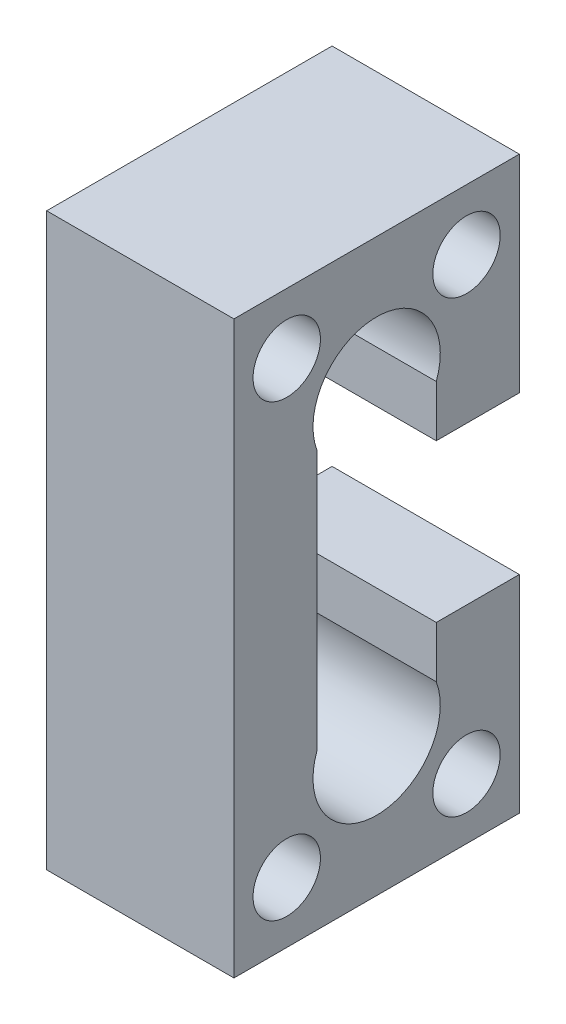
ISO-10303-21;
HEADER;
FILE_DESCRIPTION(('STEP AP214'),'2;1');
FILE_NAME('part.step','',(''),(''),'','','');
FILE_SCHEMA(('AUTOMOTIVE_DESIGN { 1 0 10303 214 1 1 1 1 }'));
ENDSEC;
DATA;
#1=APPLICATION_CONTEXT('core data for automotive mechanical design processes');
#2=APPLICATION_PROTOCOL_DEFINITION('international standard','automotive_design',2000,#1);
#3=PRODUCT_CONTEXT('',#1,'mechanical');
#4=PRODUCT('Part','Part','',(#3));
#5=PRODUCT_RELATED_PRODUCT_CATEGORY('part','',(#4));
#6=PRODUCT_DEFINITION_FORMATION('','',#4);
#7=PRODUCT_DEFINITION_CONTEXT('part definition',#1,'design');
#8=PRODUCT_DEFINITION('design','',#6,#7);
#9=PRODUCT_DEFINITION_SHAPE('','',#8);
#10=(LENGTH_UNIT() NAMED_UNIT(*) SI_UNIT(.MILLI.,.METRE.));
#11=(NAMED_UNIT(*) PLANE_ANGLE_UNIT() SI_UNIT($,.RADIAN.));
#12=(NAMED_UNIT(*) SI_UNIT($,.STERADIAN.) SOLID_ANGLE_UNIT());
#13=UNCERTAINTY_MEASURE_WITH_UNIT(LENGTH_MEASURE(1.E-05),#10,'distance_accuracy_value','');
#14=(GEOMETRIC_REPRESENTATION_CONTEXT(3) GLOBAL_UNCERTAINTY_ASSIGNED_CONTEXT((#13)) GLOBAL_UNIT_ASSIGNED_CONTEXT((#10,
#11,#12)) REPRESENTATION_CONTEXT('',''));
#15=CARTESIAN_POINT('',(0.,0.,0.));
#16=DIRECTION('',(0.,0.,1.));
#17=DIRECTION('',(1.,0.,0.));
#18=AXIS2_PLACEMENT_3D('',#15,#16,#17);
#19=CARTESIAN_POINT('',(-12.5,38.1,-19.05));
#20=DIRECTION('',(0.,0.,-1.));
#21=DIRECTION('',(-1.,0.,0.));
#22=AXIS2_PLACEMENT_3D('',#19,#20,#21);
#23=PLANE('',#22);
#24=DIRECTION('',(1.,0.,0.));
#25=VECTOR('',#24,1.);
#26=CARTESIAN_POINT('',(-12.5,10.5,-19.05));
#27=LINE('',#26,#25);
#28=CARTESIAN_POINT('',(-12.5,10.5,-19.05));
#29=VERTEX_POINT('',#28);
#30=CARTESIAN_POINT('',(12.5,10.5,-19.05));
#31=VERTEX_POINT('',#30);
#32=EDGE_CURVE('E164',#29,#31,#27,.T.);
#33=ORIENTED_EDGE('',*,*,#32,.F.);
#34=DIRECTION('',(0.,-1.,0.));
#35=VECTOR('',#34,1.);
#36=CARTESIAN_POINT('',(-12.5,-38.1,-19.05));
#37=LINE('',#36,#35);
#38=CARTESIAN_POINT('',(-12.5,38.1,-19.05));
#39=VERTEX_POINT('',#38);
#40=EDGE_CURVE('E180',#39,#29,#37,.T.);
#41=ORIENTED_EDGE('',*,*,#40,.F.);
#42=DIRECTION('',(-1.,0.,0.));
#43=VECTOR('',#42,1.);
#44=CARTESIAN_POINT('',(-12.5,38.1,-19.05));
#45=LINE('',#44,#43);
#46=CARTESIAN_POINT('',(12.5,38.1,-19.05));
#47=VERTEX_POINT('',#46);
#48=EDGE_CURVE('E191',#47,#39,#45,.T.);
#49=ORIENTED_EDGE('',*,*,#48,.F.);
#50=DIRECTION('',(0.,1.,0.));
#51=VECTOR('',#50,1.);
#52=CARTESIAN_POINT('',(12.5,-38.1,-19.05));
#53=LINE('',#52,#51);
#54=EDGE_CURVE('E187',#31,#47,#53,.T.);
#55=ORIENTED_EDGE('',*,*,#54,.F.);
#56=EDGE_LOOP('',(#33,#41,#49,#55));
#57=FACE_BOUND('',#56,.T.);
#58=ADVANCED_FACE('F34',(#57),#23,.T.);
#59=CARTESIAN_POINT('',(-12.5,-38.1,-19.05));
#60=DIRECTION('',(-1.,0.,0.));
#61=DIRECTION('',(0.,0.,1.));
#62=AXIS2_PLACEMENT_3D('',#59,#60,#61);
#63=PLANE('',#62);
#64=CARTESIAN_POINT('',(-12.5,30.,12.));
#65=DIRECTION('',(1.,0.,0.));
#66=DIRECTION('',(0.,0.,-1.));
#67=AXIS2_PLACEMENT_3D('',#64,#65,#66);
#68=CIRCLE('',#67,4.5);
#69=CARTESIAN_POINT('',(-12.5,30.,7.50000000000001));
#70=VERTEX_POINT('',#69);
#71=EDGE_CURVE('E403',#70,#70,#68,.T.);
#72=ORIENTED_EDGE('',*,*,#71,.T.);
#73=EDGE_LOOP('',(#72));
#74=FACE_BOUND('',#73,.T.);
#75=CARTESIAN_POINT('',(-12.5,30.,-12.));
#76=DIRECTION('',(1.,0.,0.));
#77=DIRECTION('',(0.,0.,-1.));
#78=AXIS2_PLACEMENT_3D('',#75,#76,#77);
#79=CIRCLE('',#78,4.5);
#80=CARTESIAN_POINT('',(-12.5,30.,-16.5));
#81=VERTEX_POINT('',#80);
#82=EDGE_CURVE('E413',#81,#81,#79,.T.);
#83=ORIENTED_EDGE('',*,*,#82,.T.);
#84=EDGE_LOOP('',(#83));
#85=FACE_BOUND('',#84,.T.);
#86=CARTESIAN_POINT('',(-12.5,-30.,-12.));
#87=DIRECTION('',(1.,0.,0.));
#88=DIRECTION('',(0.,0.,-1.));
#89=AXIS2_PLACEMENT_3D('',#86,#87,#88);
#90=CIRCLE('',#89,4.49999999999999);
#91=CARTESIAN_POINT('',(-12.5,-30.,-16.5));
#92=VERTEX_POINT('',#91);
#93=EDGE_CURVE('E419',#92,#92,#90,.T.);
#94=ORIENTED_EDGE('',*,*,#93,.T.);
#95=EDGE_LOOP('',(#94));
#96=FACE_BOUND('',#95,.T.);
#97=CARTESIAN_POINT('',(-12.5,-30.,12.));
#98=DIRECTION('',(1.,0.,0.));
#99=DIRECTION('',(0.,0.,-1.));
#100=AXIS2_PLACEMENT_3D('',#97,#98,#99);
#101=CIRCLE('',#100,4.49999999999999);
#102=CARTESIAN_POINT('',(-12.5,-30.,7.50000000000001));
#103=VERTEX_POINT('',#102);
#104=EDGE_CURVE('E153',#103,#103,#101,.T.);
#105=ORIENTED_EDGE('',*,*,#104,.T.);
#106=EDGE_LOOP('',(#105));
#107=FACE_BOUND('',#106,.T.);
#108=DIRECTION('',(0.,1.,0.));
#109=VECTOR('',#108,1.);
#110=CARTESIAN_POINT('',(-12.5,10.5,-7.96290000000001));
#111=LINE('',#110,#109);
#112=CARTESIAN_POINT('',(-12.5,10.5,-7.96290000000001));
#113=VERTEX_POINT('',#112);
#114=CARTESIAN_POINT('',(-12.5,17.3570053526879,-7.9629));
#115=VERTEX_POINT('',#114);
#116=EDGE_CURVE('E128',#113,#115,#111,.T.);
#117=ORIENTED_EDGE('',*,*,#116,.T.);
#118=CARTESIAN_POINT('',(-12.5,20.32,0.));
#119=DIRECTION('',(-1.,0.,0.));
#120=DIRECTION('',(0.,0.,1.));
#121=AXIS2_PLACEMENT_3D('',#118,#119,#120);
#122=CIRCLE('',#121,8.49629999999999);
#123=CARTESIAN_POINT('',(-12.5,17.357005352688,7.9629));
#124=VERTEX_POINT('',#123);
#125=EDGE_CURVE('E173',#124,#115,#122,.T.);
#126=ORIENTED_EDGE('',*,*,#125,.F.);
#127=DIRECTION('',(0.,-1.,0.));
#128=VECTOR('',#127,1.);
#129=CARTESIAN_POINT('',(-12.5,20.,7.9629));
#130=LINE('',#129,#128);
#131=CARTESIAN_POINT('',(-12.5,-17.357005352688,7.9629));
#132=VERTEX_POINT('',#131);
#133=EDGE_CURVE('E143',#124,#132,#130,.T.);
#134=ORIENTED_EDGE('',*,*,#133,.T.);
#135=CARTESIAN_POINT('',(-12.5,-20.32,0.));
#136=DIRECTION('',(-1.,0.,0.));
#137=DIRECTION('',(0.,0.,1.));
#138=AXIS2_PLACEMENT_3D('',#135,#136,#137);
#139=CIRCLE('',#138,8.4963);
#140=CARTESIAN_POINT('',(-12.5,-17.3570053526879,-7.96290000000001));
#141=VERTEX_POINT('',#140);
#142=EDGE_CURVE('E142',#141,#132,#139,.T.);
#143=ORIENTED_EDGE('',*,*,#142,.F.);
#144=DIRECTION('',(0.,1.,0.));
#145=VECTOR('',#144,1.);
#146=CARTESIAN_POINT('',(-12.5,-20.,-7.9629));
#147=LINE('',#146,#145);
#148=CARTESIAN_POINT('',(-12.5,-10.5,-7.96290000000001));
#149=VERTEX_POINT('',#148);
#150=EDGE_CURVE('E56',#141,#149,#147,.T.);
#151=ORIENTED_EDGE('',*,*,#150,.T.);
#152=DIRECTION('',(0.,0.,-1.));
#153=VECTOR('',#152,1.);
#154=CARTESIAN_POINT('',(-12.5,-10.5,-7.96290000000001));
#155=LINE('',#154,#153);
#156=CARTESIAN_POINT('',(-12.5,-10.5,-19.05));
#157=VERTEX_POINT('',#156);
#158=EDGE_CURVE('E131',#149,#157,#155,.T.);
#159=ORIENTED_EDGE('',*,*,#158,.T.);
#160=CARTESIAN_POINT('',(-12.5,-38.1,-19.05));
#161=VERTEX_POINT('',#160);
#162=EDGE_CURVE('E184',#157,#161,#37,.T.);
#163=ORIENTED_EDGE('',*,*,#162,.T.);
#164=DIRECTION('',(0.,0.,1.));
#165=VECTOR('',#164,1.);
#166=CARTESIAN_POINT('',(-12.5,-38.1,-19.05));
#167=LINE('',#166,#165);
#168=CARTESIAN_POINT('',(-12.5,-38.1,19.05));
#169=VERTEX_POINT('',#168);
#170=EDGE_CURVE('E194',#161,#169,#167,.T.);
#171=ORIENTED_EDGE('',*,*,#170,.T.);
#172=DIRECTION('',(0.,-1.,0.));
#173=VECTOR('',#172,1.);
#174=CARTESIAN_POINT('',(-12.5,-38.1,19.05));
#175=LINE('',#174,#173);
#176=CARTESIAN_POINT('',(-12.5,38.1,19.05));
#177=VERTEX_POINT('',#176);
#178=EDGE_CURVE('E179',#177,#169,#175,.T.);
#179=ORIENTED_EDGE('',*,*,#178,.F.);
#180=DIRECTION('',(0.,0.,1.));
#181=VECTOR('',#180,1.);
#182=CARTESIAN_POINT('',(-12.5,38.1,-19.05));
#183=LINE('',#182,#181);
#184=EDGE_CURVE('E206',#39,#177,#183,.T.);
#185=ORIENTED_EDGE('',*,*,#184,.F.);
#186=ORIENTED_EDGE('',*,*,#40,.T.);
#187=DIRECTION('',(0.,0.,1.));
#188=VECTOR('',#187,1.);
#189=CARTESIAN_POINT('',(-12.5,10.5,-19.05));
#190=LINE('',#189,#188);
#191=EDGE_CURVE('E136',#29,#113,#190,.T.);
#192=ORIENTED_EDGE('',*,*,#191,.T.);
#193=EDGE_LOOP('',(#117,#126,#134,#143,#151,#159,#163,#171,#179,#185,#186,#192));
#194=FACE_BOUND('',#193,.T.);
#195=ADVANCED_FACE('F36',(#74,#85,#96,#107,#194),#63,.T.);
#196=CARTESIAN_POINT('',(-12.5,38.1,-19.05));
#197=DIRECTION('',(0.,1.,0.));
#198=DIRECTION('',(0.,0.,1.));
#199=AXIS2_PLACEMENT_3D('',#196,#197,#198);
#200=PLANE('',#199);
#201=DIRECTION('',(-1.,0.,0.));
#202=VECTOR('',#201,1.);
#203=CARTESIAN_POINT('',(-12.5,38.1,19.05));
#204=LINE('',#203,#202);
#205=CARTESIAN_POINT('',(12.5,38.1,19.05));
#206=VERTEX_POINT('',#205);
#207=EDGE_CURVE('E203',#206,#177,#204,.T.);
#208=ORIENTED_EDGE('',*,*,#207,.F.);
#209=DIRECTION('',(0.,0.,1.));
#210=VECTOR('',#209,1.);
#211=CARTESIAN_POINT('',(12.5,38.1,-19.05));
#212=LINE('',#211,#210);
#213=EDGE_CURVE('E209',#47,#206,#212,.T.);
#214=ORIENTED_EDGE('',*,*,#213,.F.);
#215=ORIENTED_EDGE('',*,*,#48,.T.);
#216=ORIENTED_EDGE('',*,*,#184,.T.);
#217=EDGE_LOOP('',(#208,#214,#215,#216));
#218=FACE_BOUND('',#217,.T.);
#219=ADVANCED_FACE('F241',(#218),#200,.T.);
#220=CARTESIAN_POINT('',(12.5,-38.1,-19.05));
#221=DIRECTION('',(1.,0.,0.));
#222=DIRECTION('',(0.,0.,-1.));
#223=AXIS2_PLACEMENT_3D('',#220,#221,#222);
#224=PLANE('',#223);
#225=CARTESIAN_POINT('',(12.5,30.,12.));
#226=DIRECTION('',(1.,0.,0.));
#227=DIRECTION('',(0.,0.,-1.));
#228=AXIS2_PLACEMENT_3D('',#225,#226,#227);
#229=CIRCLE('',#228,4.5);
#230=CARTESIAN_POINT('',(12.5,30.,7.50000000000001));
#231=VERTEX_POINT('',#230);
#232=EDGE_CURVE('E406',#231,#231,#229,.T.);
#233=ORIENTED_EDGE('',*,*,#232,.F.);
#234=EDGE_LOOP('',(#233));
#235=FACE_BOUND('',#234,.T.);
#236=CARTESIAN_POINT('',(12.5,30.,-12.));
#237=DIRECTION('',(1.,0.,0.));
#238=DIRECTION('',(0.,0.,-1.));
#239=AXIS2_PLACEMENT_3D('',#236,#237,#238);
#240=CIRCLE('',#239,4.5);
#241=CARTESIAN_POINT('',(12.5,30.,-16.5));
#242=VERTEX_POINT('',#241);
#243=EDGE_CURVE('E408',#242,#242,#240,.T.);
#244=ORIENTED_EDGE('',*,*,#243,.F.);
#245=EDGE_LOOP('',(#244));
#246=FACE_BOUND('',#245,.T.);
#247=CARTESIAN_POINT('',(12.5,-30.,-12.));
#248=DIRECTION('',(1.,0.,0.));
#249=DIRECTION('',(0.,0.,-1.));
#250=AXIS2_PLACEMENT_3D('',#247,#248,#249);
#251=CIRCLE('',#250,4.5);
#252=CARTESIAN_POINT('',(12.5,-30.,-16.5));
#253=VERTEX_POINT('',#252);
#254=EDGE_CURVE('E416',#253,#253,#251,.T.);
#255=ORIENTED_EDGE('',*,*,#254,.F.);
#256=EDGE_LOOP('',(#255));
#257=FACE_BOUND('',#256,.T.);
#258=CARTESIAN_POINT('',(12.5,-30.,12.));
#259=DIRECTION('',(1.,0.,0.));
#260=DIRECTION('',(0.,0.,-1.));
#261=AXIS2_PLACEMENT_3D('',#258,#259,#260);
#262=CIRCLE('',#261,4.5);
#263=CARTESIAN_POINT('',(12.5,-30.,7.5));
#264=VERTEX_POINT('',#263);
#265=EDGE_CURVE('E422',#264,#264,#262,.T.);
#266=ORIENTED_EDGE('',*,*,#265,.F.);
#267=EDGE_LOOP('',(#266));
#268=FACE_BOUND('',#267,.T.);
#269=DIRECTION('',(0.,1.,0.));
#270=VECTOR('',#269,1.);
#271=CARTESIAN_POINT('',(12.5,10.5,-7.96290000000001));
#272=LINE('',#271,#270);
#273=CARTESIAN_POINT('',(12.5,10.5,-7.96290000000001));
#274=VERTEX_POINT('',#273);
#275=CARTESIAN_POINT('',(12.5,17.3570053526879,-7.9629));
#276=VERTEX_POINT('',#275);
#277=EDGE_CURVE('E49',#274,#276,#272,.T.);
#278=ORIENTED_EDGE('',*,*,#277,.F.);
#279=DIRECTION('',(0.,0.,1.));
#280=VECTOR('',#279,1.);
#281=CARTESIAN_POINT('',(12.5,10.5,-19.05));
#282=LINE('',#281,#280);
#283=EDGE_CURVE('E157',#31,#274,#282,.T.);
#284=ORIENTED_EDGE('',*,*,#283,.F.);
#285=ORIENTED_EDGE('',*,*,#54,.T.);
#286=ORIENTED_EDGE('',*,*,#213,.T.);
#287=DIRECTION('',(0.,1.,0.));
#288=VECTOR('',#287,1.);
#289=CARTESIAN_POINT('',(12.5,-38.1,19.05));
#290=LINE('',#289,#288);
#291=CARTESIAN_POINT('',(12.5,-38.1,19.05));
#292=VERTEX_POINT('',#291);
#293=EDGE_CURVE('E200',#292,#206,#290,.T.);
#294=ORIENTED_EDGE('',*,*,#293,.F.);
#295=DIRECTION('',(0.,0.,1.));
#296=VECTOR('',#295,1.);
#297=CARTESIAN_POINT('',(12.5,-38.1,-19.05));
#298=LINE('',#297,#296);
#299=CARTESIAN_POINT('',(12.5,-38.1,-19.05));
#300=VERTEX_POINT('',#299);
#301=EDGE_CURVE('E211',#300,#292,#298,.T.);
#302=ORIENTED_EDGE('',*,*,#301,.F.);
#303=CARTESIAN_POINT('',(12.5,-10.5,-19.05));
#304=VERTEX_POINT('',#303);
#305=EDGE_CURVE('E188',#300,#304,#53,.T.);
#306=ORIENTED_EDGE('',*,*,#305,.T.);
#307=DIRECTION('',(0.,0.,-1.));
#308=VECTOR('',#307,1.);
#309=CARTESIAN_POINT('',(12.5,-10.5,-7.96290000000001));
#310=LINE('',#309,#308);
#311=CARTESIAN_POINT('',(12.5,-10.5,-7.96290000000001));
#312=VERTEX_POINT('',#311);
#313=EDGE_CURVE('E155',#312,#304,#310,.T.);
#314=ORIENTED_EDGE('',*,*,#313,.F.);
#315=DIRECTION('',(0.,1.,0.));
#316=VECTOR('',#315,1.);
#317=CARTESIAN_POINT('',(12.5,-20.,-7.9629));
#318=LINE('',#317,#316);
#319=CARTESIAN_POINT('',(12.5,-17.3570053526879,-7.9629));
#320=VERTEX_POINT('',#319);
#321=EDGE_CURVE('E124',#320,#312,#318,.T.);
#322=ORIENTED_EDGE('',*,*,#321,.F.);
#323=CARTESIAN_POINT('',(12.5,-20.32,0.));
#324=DIRECTION('',(-1.,0.,0.));
#325=DIRECTION('',(0.,0.,1.));
#326=AXIS2_PLACEMENT_3D('',#323,#324,#325);
#327=CIRCLE('',#326,8.49629999999999);
#328=CARTESIAN_POINT('',(12.5,-17.357005352688,7.9629));
#329=VERTEX_POINT('',#328);
#330=EDGE_CURVE('E170',#320,#329,#327,.T.);
#331=ORIENTED_EDGE('',*,*,#330,.T.);
#332=DIRECTION('',(0.,-1.,0.));
#333=VECTOR('',#332,1.);
#334=CARTESIAN_POINT('',(12.5,20.,7.9629));
#335=LINE('',#334,#333);
#336=CARTESIAN_POINT('',(12.5,17.357005352688,7.9629));
#337=VERTEX_POINT('',#336);
#338=EDGE_CURVE('E151',#337,#329,#335,.T.);
#339=ORIENTED_EDGE('',*,*,#338,.F.);
#340=CARTESIAN_POINT('',(12.5,20.32,0.));
#341=DIRECTION('',(-1.,0.,0.));
#342=DIRECTION('',(0.,0.,1.));
#343=AXIS2_PLACEMENT_3D('',#340,#341,#342);
#344=CIRCLE('',#343,8.49629999999999);
#345=EDGE_CURVE('E176',#337,#276,#344,.T.);
#346=ORIENTED_EDGE('',*,*,#345,.T.);
#347=EDGE_LOOP('',(#278,#284,#285,#286,#294,#302,#306,#314,#322,#331,#339,#346));
#348=FACE_BOUND('',#347,.T.);
#349=ADVANCED_FACE('F219',(#235,#246,#257,#268,#348),#224,.T.);
#350=CARTESIAN_POINT('',(-12.5,-38.1,-19.05));
#351=DIRECTION('',(0.,-1.,0.));
#352=DIRECTION('',(0.,0.,-1.));
#353=AXIS2_PLACEMENT_3D('',#350,#351,#352);
#354=PLANE('',#353);
#355=DIRECTION('',(1.,0.,0.));
#356=VECTOR('',#355,1.);
#357=CARTESIAN_POINT('',(-12.5,-38.1,19.05));
#358=LINE('',#357,#356);
#359=EDGE_CURVE('E197',#169,#292,#358,.T.);
#360=ORIENTED_EDGE('',*,*,#359,.F.);
#361=ORIENTED_EDGE('',*,*,#170,.F.);
#362=DIRECTION('',(1.,0.,0.));
#363=VECTOR('',#362,1.);
#364=CARTESIAN_POINT('',(-12.5,-38.1,-19.05));
#365=LINE('',#364,#363);
#366=EDGE_CURVE('E183',#161,#300,#365,.T.);
#367=ORIENTED_EDGE('',*,*,#366,.T.);
#368=ORIENTED_EDGE('',*,*,#301,.T.);
#369=EDGE_LOOP('',(#360,#361,#367,#368));
#370=FACE_BOUND('',#369,.T.);
#371=ADVANCED_FACE('F229',(#370),#354,.T.);
#372=DIRECTION('',(1.,0.,0.));
#373=VECTOR('',#372,1.);
#374=CARTESIAN_POINT('',(-12.5,-10.5,-19.05));
#375=LINE('',#374,#373);
#376=EDGE_CURVE('E127',#157,#304,#375,.T.);
#377=ORIENTED_EDGE('',*,*,#376,.T.);
#378=ORIENTED_EDGE('',*,*,#305,.F.);
#379=ORIENTED_EDGE('',*,*,#366,.F.);
#380=ORIENTED_EDGE('',*,*,#162,.F.);
#381=EDGE_LOOP('',(#377,#378,#379,#380));
#382=FACE_BOUND('',#381,.T.);
#383=ADVANCED_FACE('F223',(#382),#23,.T.);
#384=CARTESIAN_POINT('',(-12.5,38.1,19.05));
#385=DIRECTION('',(0.,0.,-1.));
#386=DIRECTION('',(-1.,0.,0.));
#387=AXIS2_PLACEMENT_3D('',#384,#385,#386);
#388=PLANE('',#387);
#389=ORIENTED_EDGE('',*,*,#178,.T.);
#390=ORIENTED_EDGE('',*,*,#359,.T.);
#391=ORIENTED_EDGE('',*,*,#293,.T.);
#392=ORIENTED_EDGE('',*,*,#207,.T.);
#393=EDGE_LOOP('',(#389,#390,#391,#392));
#394=FACE_BOUND('',#393,.T.);
#395=ADVANCED_FACE('F232',(#394),#388,.F.);
#396=CARTESIAN_POINT('',(-12.5,20.32,0.));
#397=DIRECTION('',(-1.,0.,0.));
#398=DIRECTION('',(0.,0.,1.));
#399=AXIS2_PLACEMENT_3D('',#396,#397,#398);
#400=CYLINDRICAL_SURFACE('',#399,8.49629999999999);
#401=ORIENTED_EDGE('',*,*,#125,.T.);
#402=DIRECTION('',(-1.,0.,0.));
#403=VECTOR('',#402,1.);
#404=CARTESIAN_POINT('',(-12.5,17.3570053526879,-7.9629));
#405=LINE('',#404,#403);
#406=EDGE_CURVE('E11',#115,#276,#405,.F.);
#407=ORIENTED_EDGE('',*,*,#406,.T.);
#408=ORIENTED_EDGE('',*,*,#345,.F.);
#409=DIRECTION('',(-1.,0.,0.));
#410=VECTOR('',#409,1.);
#411=CARTESIAN_POINT('',(-12.5,17.357005352688,7.9629));
#412=LINE('',#411,#410);
#413=EDGE_CURVE('E163',#337,#124,#412,.T.);
#414=ORIENTED_EDGE('',*,*,#413,.T.);
#415=EDGE_LOOP('',(#401,#407,#408,#414));
#416=FACE_BOUND('',#415,.T.);
#417=ADVANCED_FACE('F248',(#416),#400,.F.);
#418=CARTESIAN_POINT('',(-12.5,-20.32,0.));
#419=DIRECTION('',(-1.,0.,0.));
#420=DIRECTION('',(0.,0.,1.));
#421=AXIS2_PLACEMENT_3D('',#418,#419,#420);
#422=CYLINDRICAL_SURFACE('',#421,8.49629999999999);
#423=ORIENTED_EDGE('',*,*,#330,.F.);
#424=DIRECTION('',(-1.,0.,0.));
#425=VECTOR('',#424,1.);
#426=CARTESIAN_POINT('',(-12.5,-17.3570053526879,-7.9629));
#427=LINE('',#426,#425);
#428=EDGE_CURVE('E42',#320,#141,#427,.T.);
#429=ORIENTED_EDGE('',*,*,#428,.T.);
#430=ORIENTED_EDGE('',*,*,#142,.T.);
#431=DIRECTION('',(-1.,0.,0.));
#432=VECTOR('',#431,1.);
#433=CARTESIAN_POINT('',(-12.5,-17.357005352688,7.9629));
#434=LINE('',#433,#432);
#435=EDGE_CURVE('E208',#132,#329,#434,.F.);
#436=ORIENTED_EDGE('',*,*,#435,.T.);
#437=EDGE_LOOP('',(#423,#429,#430,#436));
#438=FACE_BOUND('',#437,.T.);
#439=ADVANCED_FACE('F217',(#438),#422,.F.);
#440=CARTESIAN_POINT('',(-12.5,20.,7.9629));
#441=DIRECTION('',(0.,0.,1.));
#442=DIRECTION('',(1.,0.,0.));
#443=AXIS2_PLACEMENT_3D('',#440,#441,#442);
#444=PLANE('',#443);
#445=ORIENTED_EDGE('',*,*,#338,.T.);
#446=ORIENTED_EDGE('',*,*,#435,.F.);
#447=ORIENTED_EDGE('',*,*,#133,.F.);
#448=ORIENTED_EDGE('',*,*,#413,.F.);
#449=EDGE_LOOP('',(#445,#446,#447,#448));
#450=FACE_BOUND('',#449,.T.);
#451=ADVANCED_FACE('F251',(#450),#444,.F.);
#452=CARTESIAN_POINT('',(-12.5,-20.,-7.9629));
#453=DIRECTION('',(0.,0.,-1.));
#454=DIRECTION('',(0.,1.,0.));
#455=AXIS2_PLACEMENT_3D('',#452,#453,#454);
#456=PLANE('',#455);
#457=ORIENTED_EDGE('',*,*,#321,.T.);
#458=DIRECTION('',(1.,0.,0.));
#459=VECTOR('',#458,1.);
#460=CARTESIAN_POINT('',(-12.5,-10.5,-7.96290000000001));
#461=LINE('',#460,#459);
#462=EDGE_CURVE('E120',#149,#312,#461,.T.);
#463=ORIENTED_EDGE('',*,*,#462,.F.);
#464=ORIENTED_EDGE('',*,*,#150,.F.);
#465=ORIENTED_EDGE('',*,*,#428,.F.);
#466=EDGE_LOOP('',(#457,#463,#464,#465));
#467=FACE_BOUND('',#466,.T.);
#468=ADVANCED_FACE('F122',(#467),#456,.F.);
#469=CARTESIAN_POINT('',(-12.5,-10.5,-7.96290000000001));
#470=DIRECTION('',(0.,-1.,0.));
#471=DIRECTION('',(0.,0.,-1.));
#472=AXIS2_PLACEMENT_3D('',#469,#470,#471);
#473=PLANE('',#472);
#474=ORIENTED_EDGE('',*,*,#313,.T.);
#475=ORIENTED_EDGE('',*,*,#376,.F.);
#476=ORIENTED_EDGE('',*,*,#158,.F.);
#477=ORIENTED_EDGE('',*,*,#462,.T.);
#478=EDGE_LOOP('',(#474,#475,#476,#477));
#479=FACE_BOUND('',#478,.T.);
#480=ADVANCED_FACE('F132',(#479),#473,.F.);
#481=CARTESIAN_POINT('',(-12.5,10.5,-7.96290000000001));
#482=DIRECTION('',(0.,0.,-1.));
#483=DIRECTION('',(0.,1.,0.));
#484=AXIS2_PLACEMENT_3D('',#481,#482,#483);
#485=PLANE('',#484);
#486=ORIENTED_EDGE('',*,*,#116,.F.);
#487=DIRECTION('',(1.,0.,0.));
#488=VECTOR('',#487,1.);
#489=CARTESIAN_POINT('',(-12.5,10.5,-7.96290000000001));
#490=LINE('',#489,#488);
#491=EDGE_CURVE('E161',#113,#274,#490,.T.);
#492=ORIENTED_EDGE('',*,*,#491,.T.);
#493=ORIENTED_EDGE('',*,*,#277,.T.);
#494=ORIENTED_EDGE('',*,*,#406,.F.);
#495=EDGE_LOOP('',(#486,#492,#493,#494));
#496=FACE_BOUND('',#495,.T.);
#497=ADVANCED_FACE('F341',(#496),#485,.F.);
#498=CARTESIAN_POINT('',(-12.5,10.5,-19.05));
#499=DIRECTION('',(0.,1.,0.));
#500=DIRECTION('',(0.,0.,1.));
#501=AXIS2_PLACEMENT_3D('',#498,#499,#500);
#502=PLANE('',#501);
#503=ORIENTED_EDGE('',*,*,#283,.T.);
#504=ORIENTED_EDGE('',*,*,#491,.F.);
#505=ORIENTED_EDGE('',*,*,#191,.F.);
#506=ORIENTED_EDGE('',*,*,#32,.T.);
#507=EDGE_LOOP('',(#503,#504,#505,#506));
#508=FACE_BOUND('',#507,.T.);
#509=ADVANCED_FACE('F244',(#508),#502,.F.);
#510=CARTESIAN_POINT('',(12.5,-30.,12.));
#511=DIRECTION('',(1.,0.,0.));
#512=DIRECTION('',(0.,0.,-1.));
#513=AXIS2_PLACEMENT_3D('',#510,#511,#512);
#514=CYLINDRICAL_SURFACE('',#513,4.5);
#515=ORIENTED_EDGE('',*,*,#104,.F.);
#516=EDGE_LOOP('',(#515));
#517=FACE_BOUND('',#516,.T.);
#518=ORIENTED_EDGE('',*,*,#265,.T.);
#519=EDGE_LOOP('',(#518));
#520=FACE_BOUND('',#519,.T.);
#521=ADVANCED_FACE('F297',(#517,#520),#514,.F.);
#522=CARTESIAN_POINT('',(12.5,-30.,-12.));
#523=DIRECTION('',(1.,0.,0.));
#524=DIRECTION('',(0.,0.,-1.));
#525=AXIS2_PLACEMENT_3D('',#522,#523,#524);
#526=CYLINDRICAL_SURFACE('',#525,4.5);
#527=ORIENTED_EDGE('',*,*,#93,.F.);
#528=EDGE_LOOP('',(#527));
#529=FACE_BOUND('',#528,.T.);
#530=ORIENTED_EDGE('',*,*,#254,.T.);
#531=EDGE_LOOP('',(#530));
#532=FACE_BOUND('',#531,.T.);
#533=ADVANCED_FACE('F302',(#529,#532),#526,.F.);
#534=CARTESIAN_POINT('',(12.5,30.,-12.));
#535=DIRECTION('',(1.,0.,0.));
#536=DIRECTION('',(0.,0.,-1.));
#537=AXIS2_PLACEMENT_3D('',#534,#535,#536);
#538=CYLINDRICAL_SURFACE('',#537,4.5);
#539=ORIENTED_EDGE('',*,*,#82,.F.);
#540=EDGE_LOOP('',(#539));
#541=FACE_BOUND('',#540,.T.);
#542=ORIENTED_EDGE('',*,*,#243,.T.);
#543=EDGE_LOOP('',(#542));
#544=FACE_BOUND('',#543,.T.);
#545=ADVANCED_FACE('F314',(#541,#544),#538,.F.);
#546=CARTESIAN_POINT('',(12.5,30.,12.));
#547=DIRECTION('',(1.,0.,0.));
#548=DIRECTION('',(0.,0.,-1.));
#549=AXIS2_PLACEMENT_3D('',#546,#547,#548);
#550=CYLINDRICAL_SURFACE('',#549,4.5);
#551=ORIENTED_EDGE('',*,*,#71,.F.);
#552=EDGE_LOOP('',(#551));
#553=FACE_BOUND('',#552,.T.);
#554=ORIENTED_EDGE('',*,*,#232,.T.);
#555=EDGE_LOOP('',(#554));
#556=FACE_BOUND('',#555,.T.);
#557=ADVANCED_FACE('F324',(#553,#556),#550,.F.);
#558=CLOSED_SHELL('',(#58,#195,#219,#349,#371,#383,#395,#417,#439,#451,#468,#480,#497,#509,#521,
#533,#545,#557));
#559=MANIFOLD_SOLID_BREP('B2',#558);
#560=ADVANCED_BREP_SHAPE_REPRESENTATION('',(#18,#559),#14);
#561=SHAPE_DEFINITION_REPRESENTATION(#9,#560);
ENDSEC;
END-ISO-10303-21;
